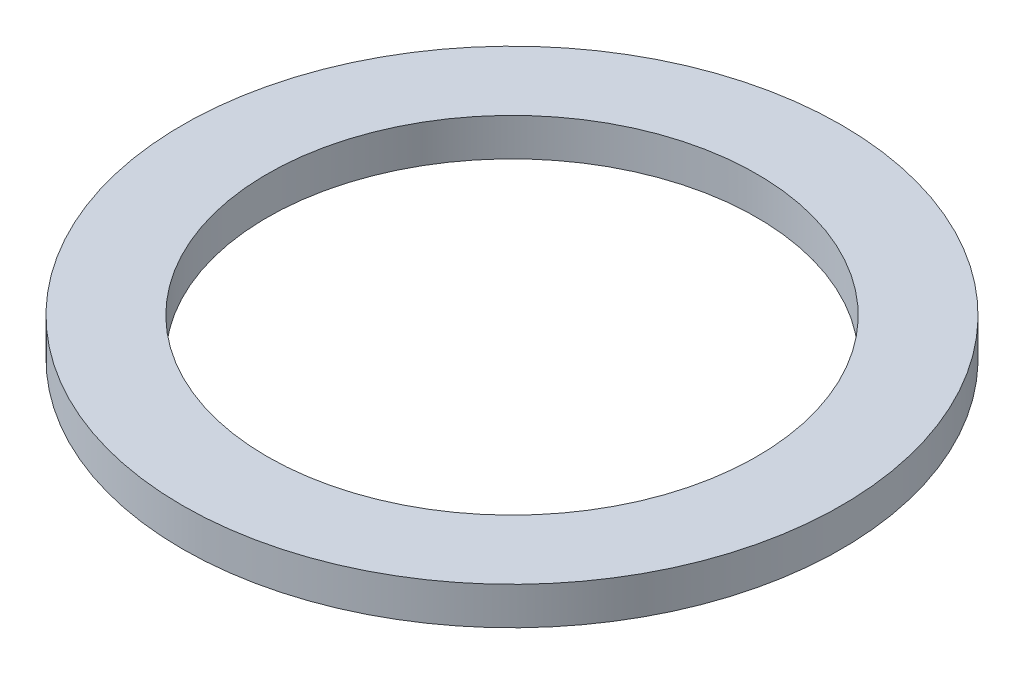
ISO-10303-21;
HEADER;
FILE_DESCRIPTION(('STEP AP214'),'2;1');
FILE_NAME('part.step','',(''),(''),'','','');
FILE_SCHEMA(('AUTOMOTIVE_DESIGN { 1 0 10303 214 1 1 1 1 }'));
ENDSEC;
DATA;
#1=APPLICATION_CONTEXT('core data for automotive mechanical design processes');
#2=APPLICATION_PROTOCOL_DEFINITION('international standard','automotive_design',2000,#1);
#3=PRODUCT_CONTEXT('',#1,'mechanical');
#4=PRODUCT('Part','Part','',(#3));
#5=PRODUCT_RELATED_PRODUCT_CATEGORY('part','',(#4));
#6=PRODUCT_DEFINITION_FORMATION('','',#4);
#7=PRODUCT_DEFINITION_CONTEXT('part definition',#1,'design');
#8=PRODUCT_DEFINITION('design','',#6,#7);
#9=PRODUCT_DEFINITION_SHAPE('','',#8);
#10=(LENGTH_UNIT() NAMED_UNIT(*) SI_UNIT(.MILLI.,.METRE.));
#11=(NAMED_UNIT(*) PLANE_ANGLE_UNIT() SI_UNIT($,.RADIAN.));
#12=(NAMED_UNIT(*) SI_UNIT($,.STERADIAN.) SOLID_ANGLE_UNIT());
#13=UNCERTAINTY_MEASURE_WITH_UNIT(LENGTH_MEASURE(1.E-05),#10,'distance_accuracy_value','');
#14=(GEOMETRIC_REPRESENTATION_CONTEXT(3) GLOBAL_UNCERTAINTY_ASSIGNED_CONTEXT((#13)) GLOBAL_UNIT_ASSIGNED_CONTEXT((#10,
#11,#12)) REPRESENTATION_CONTEXT('',''));
#15=CARTESIAN_POINT('',(0.,0.,0.));
#16=DIRECTION('',(0.,0.,1.));
#17=DIRECTION('',(1.,0.,0.));
#18=AXIS2_PLACEMENT_3D('',#15,#16,#17);
#19=CARTESIAN_POINT('',(0.,0.8,0.));
#20=DIRECTION('',(0.,1.,0.));
#21=DIRECTION('',(0.,0.,1.));
#22=AXIS2_PLACEMENT_3D('',#19,#20,#21);
#23=PLANE('',#22);
#24=CARTESIAN_POINT('',(0.,0.8,0.));
#25=DIRECTION('',(0.,1.,0.));
#26=DIRECTION('',(0.,0.,1.));
#27=AXIS2_PLACEMENT_3D('',#24,#25,#26);
#28=CIRCLE('',#27,7.);
#29=CARTESIAN_POINT('',(0.,0.8,7.));
#30=VERTEX_POINT('',#29);
#31=EDGE_CURVE('E10',#30,#30,#28,.T.);
#32=ORIENTED_EDGE('',*,*,#31,.T.);
#33=EDGE_LOOP('',(#32));
#34=FACE_BOUND('',#33,.T.);
#35=CARTESIAN_POINT('',(0.,0.8,0.));
#36=DIRECTION('',(0.,1.,0.));
#37=DIRECTION('',(0.,0.,1.));
#38=AXIS2_PLACEMENT_3D('',#35,#36,#37);
#39=CIRCLE('',#38,5.2);
#40=CARTESIAN_POINT('',(0.,0.8,5.2));
#41=VERTEX_POINT('',#40);
#42=EDGE_CURVE('E56',#41,#41,#39,.T.);
#43=ORIENTED_EDGE('',*,*,#42,.F.);
#44=EDGE_LOOP('',(#43));
#45=FACE_BOUND('',#44,.T.);
#46=ADVANCED_FACE('F43',(#34,#45),#23,.T.);
#47=CARTESIAN_POINT('',(0.,0.,0.));
#48=DIRECTION('',(0.,1.,0.));
#49=DIRECTION('',(0.,0.,1.));
#50=AXIS2_PLACEMENT_3D('',#47,#48,#49);
#51=PLANE('',#50);
#52=CARTESIAN_POINT('',(0.,0.,0.));
#53=DIRECTION('',(0.,1.,0.));
#54=DIRECTION('',(0.,0.,1.));
#55=AXIS2_PLACEMENT_3D('',#52,#53,#54);
#56=CIRCLE('',#55,7.);
#57=CARTESIAN_POINT('',(0.,0.,7.));
#58=VERTEX_POINT('',#57);
#59=EDGE_CURVE('E47',#58,#58,#56,.T.);
#60=ORIENTED_EDGE('',*,*,#59,.F.);
#61=EDGE_LOOP('',(#60));
#62=FACE_BOUND('',#61,.T.);
#63=CARTESIAN_POINT('',(0.,0.,0.));
#64=DIRECTION('',(0.,1.,0.));
#65=DIRECTION('',(0.,0.,1.));
#66=AXIS2_PLACEMENT_3D('',#63,#64,#65);
#67=CIRCLE('',#66,5.2);
#68=CARTESIAN_POINT('',(0.,0.,5.2));
#69=VERTEX_POINT('',#68);
#70=EDGE_CURVE('E58',#69,#69,#67,.T.);
#71=ORIENTED_EDGE('',*,*,#70,.T.);
#72=EDGE_LOOP('',(#71));
#73=FACE_BOUND('',#72,.T.);
#74=ADVANCED_FACE('F70',(#62,#73),#51,.F.);
#75=CARTESIAN_POINT('',(0.,0.8,0.));
#76=DIRECTION('',(0.,-1.,0.));
#77=DIRECTION('',(0.,0.,-1.));
#78=AXIS2_PLACEMENT_3D('',#75,#76,#77);
#79=CYLINDRICAL_SURFACE('',#78,7.);
#80=ORIENTED_EDGE('',*,*,#31,.F.);
#81=EDGE_LOOP('',(#80));
#82=FACE_BOUND('',#81,.T.);
#83=ORIENTED_EDGE('',*,*,#59,.T.);
#84=EDGE_LOOP('',(#83));
#85=FACE_BOUND('',#84,.T.);
#86=ADVANCED_FACE('F45',(#82,#85),#79,.T.);
#87=CARTESIAN_POINT('',(0.,0.8,0.));
#88=DIRECTION('',(0.,-1.,0.));
#89=DIRECTION('',(0.,0.,-1.));
#90=AXIS2_PLACEMENT_3D('',#87,#88,#89);
#91=CYLINDRICAL_SURFACE('',#90,5.2);
#92=ORIENTED_EDGE('',*,*,#42,.T.);
#93=EDGE_LOOP('',(#92));
#94=FACE_BOUND('',#93,.T.);
#95=ORIENTED_EDGE('',*,*,#70,.F.);
#96=EDGE_LOOP('',(#95));
#97=FACE_BOUND('',#96,.T.);
#98=ADVANCED_FACE('F66',(#94,#97),#91,.F.);
#99=CLOSED_SHELL('',(#46,#74,#86,#98));
#100=MANIFOLD_SOLID_BREP('B2',#99);
#101=ADVANCED_BREP_SHAPE_REPRESENTATION('',(#18,#100),#14);
#102=SHAPE_DEFINITION_REPRESENTATION(#9,#101);
ENDSEC;
END-ISO-10303-21;
